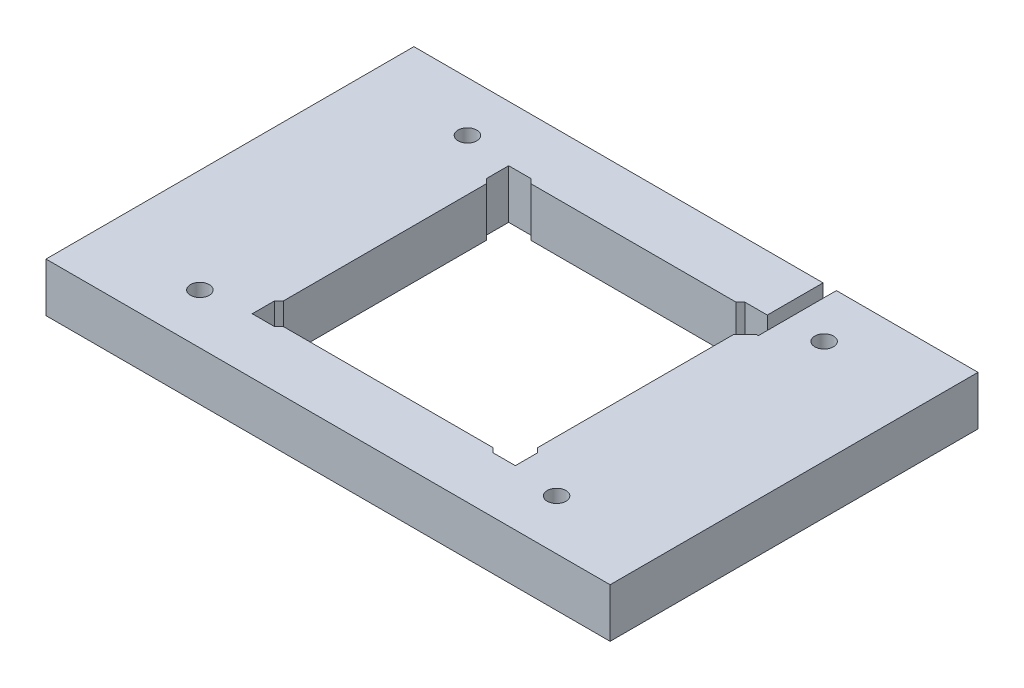
ISO-10303-21;
HEADER;
FILE_DESCRIPTION(('STEP AP214'),'2;1');
FILE_NAME('part.step','',(''),(''),'','','');
FILE_SCHEMA(('AUTOMOTIVE_DESIGN { 1 0 10303 214 1 1 1 1 }'));
ENDSEC;
DATA;
#1=APPLICATION_CONTEXT('core data for automotive mechanical design processes');
#2=APPLICATION_PROTOCOL_DEFINITION('international standard','automotive_design',2000,#1);
#3=PRODUCT_CONTEXT('',#1,'mechanical');
#4=PRODUCT('Part','Part','',(#3));
#5=PRODUCT_RELATED_PRODUCT_CATEGORY('part','',(#4));
#6=PRODUCT_DEFINITION_FORMATION('','',#4);
#7=PRODUCT_DEFINITION_CONTEXT('part definition',#1,'design');
#8=PRODUCT_DEFINITION('design','',#6,#7);
#9=PRODUCT_DEFINITION_SHAPE('','',#8);
#10=(LENGTH_UNIT() NAMED_UNIT(*) SI_UNIT(.MILLI.,.METRE.));
#11=(NAMED_UNIT(*) PLANE_ANGLE_UNIT() SI_UNIT($,.RADIAN.));
#12=(NAMED_UNIT(*) SI_UNIT($,.STERADIAN.) SOLID_ANGLE_UNIT());
#13=UNCERTAINTY_MEASURE_WITH_UNIT(LENGTH_MEASURE(1.E-05),#10,'distance_accuracy_value','');
#14=(GEOMETRIC_REPRESENTATION_CONTEXT(3) GLOBAL_UNCERTAINTY_ASSIGNED_CONTEXT((#13)) GLOBAL_UNIT_ASSIGNED_CONTEXT((#10,
#11,#12)) REPRESENTATION_CONTEXT('',''));
#15=CARTESIAN_POINT('',(0.,0.,0.));
#16=DIRECTION('',(0.,0.,1.));
#17=DIRECTION('',(1.,0.,0.));
#18=AXIS2_PLACEMENT_3D('',#15,#16,#17);
#19=CARTESIAN_POINT('',(0.,11.,0.));
#20=DIRECTION('',(0.,-1.,0.));
#21=DIRECTION('',(0.,0.,-1.));
#22=AXIS2_PLACEMENT_3D('',#19,#20,#21);
#23=PLANE('',#22);
#24=DIRECTION('',(1.,0.,0.));
#25=VECTOR('',#24,1.);
#26=CARTESIAN_POINT('',(-24.5,11.,-27.75));
#27=LINE('',#26,#25);
#28=CARTESIAN_POINT('',(-23.5,11.,-27.75));
#29=VERTEX_POINT('',#28);
#30=CARTESIAN_POINT('',(22.5,11.,-27.75));
#31=VERTEX_POINT('',#30);
#32=EDGE_CURVE('E434',#29,#31,#27,.T.);
#33=ORIENTED_EDGE('',*,*,#32,.T.);
#34=DIRECTION('',(-0.707106781186552,0.,0.707106781186543));
#35=VECTOR('',#34,1.);
#36=CARTESIAN_POINT('',(23.5,11.,-28.75));
#37=LINE('',#36,#35);
#38=CARTESIAN_POINT('',(23.5,11.,-28.75));
#39=VERTEX_POINT('',#38);
#40=EDGE_CURVE('E283',#31,#39,#37,.F.);
#41=ORIENTED_EDGE('',*,*,#40,.T.);
#42=DIRECTION('',(1.,0.,0.));
#43=VECTOR('',#42,1.);
#44=CARTESIAN_POINT('',(28.5,11.,-28.75));
#45=LINE('',#44,#43);
#46=CARTESIAN_POINT('',(28.5,11.,-28.75));
#47=VERTEX_POINT('',#46);
#48=EDGE_CURVE('E230',#39,#47,#45,.T.);
#49=ORIENTED_EDGE('',*,*,#48,.T.);
#50=DIRECTION('',(0.,0.,-1.));
#51=VECTOR('',#50,1.);
#52=CARTESIAN_POINT('',(28.5,11.,-28.75));
#53=LINE('',#52,#51);
#54=CARTESIAN_POINT('',(28.5,11.,-41.25));
#55=VERTEX_POINT('',#54);
#56=EDGE_CURVE('E224',#47,#55,#53,.T.);
#57=ORIENTED_EDGE('',*,*,#56,.T.);
#58=DIRECTION('',(-1.,0.,0.));
#59=VECTOR('',#58,1.);
#60=CARTESIAN_POINT('',(-63.25,11.,-41.25));
#61=LINE('',#60,#59);
#62=CARTESIAN_POINT('',(-63.25,11.,-41.25));
#63=VERTEX_POINT('',#62);
#64=EDGE_CURVE('E214',#55,#63,#61,.T.);
#65=ORIENTED_EDGE('',*,*,#64,.T.);
#66=DIRECTION('',(0.,0.,1.));
#67=VECTOR('',#66,1.);
#68=CARTESIAN_POINT('',(-63.25,11.,41.25));
#69=LINE('',#68,#67);
#70=CARTESIAN_POINT('',(-63.25,11.,41.25));
#71=VERTEX_POINT('',#70);
#72=EDGE_CURVE('E223',#63,#71,#69,.T.);
#73=ORIENTED_EDGE('',*,*,#72,.T.);
#74=DIRECTION('',(1.,0.,0.));
#75=VECTOR('',#74,1.);
#76=CARTESIAN_POINT('',(-63.25,11.,41.25));
#77=LINE('',#76,#75);
#78=CARTESIAN_POINT('',(63.25,11.,41.25));
#79=VERTEX_POINT('',#78);
#80=EDGE_CURVE('E383',#71,#79,#77,.T.);
#81=ORIENTED_EDGE('',*,*,#80,.T.);
#82=DIRECTION('',(0.,0.,-1.));
#83=VECTOR('',#82,1.);
#84=CARTESIAN_POINT('',(63.25,11.,-41.25));
#85=LINE('',#84,#83);
#86=CARTESIAN_POINT('',(63.25,11.,-41.25));
#87=VERTEX_POINT('',#86);
#88=EDGE_CURVE('E440',#79,#87,#85,.T.);
#89=ORIENTED_EDGE('',*,*,#88,.T.);
#90=DIRECTION('',(-1.,0.,0.));
#91=VECTOR('',#90,1.);
#92=CARTESIAN_POINT('',(31.5,11.,-41.25));
#93=LINE('',#92,#91);
#94=CARTESIAN_POINT('',(31.5,11.,-41.25));
#95=VERTEX_POINT('',#94);
#96=EDGE_CURVE('E444',#87,#95,#93,.T.);
#97=ORIENTED_EDGE('',*,*,#96,.T.);
#98=DIRECTION('',(0.,0.,1.));
#99=VECTOR('',#98,1.);
#100=CARTESIAN_POINT('',(31.4999999999999,11.,-27.75));
#101=LINE('',#100,#99);
#102=CARTESIAN_POINT('',(31.4999999999999,11.,-23.75));
#103=VERTEX_POINT('',#102);
#104=EDGE_CURVE('E446',#95,#103,#101,.T.);
#105=ORIENTED_EDGE('',*,*,#104,.T.);
#106=DIRECTION('',(-1.,0.,0.));
#107=VECTOR('',#106,1.);
#108=CARTESIAN_POINT('',(31.4999999999999,11.,-23.75));
#109=LINE('',#108,#107);
#110=CARTESIAN_POINT('',(31.,11.,-23.75));
#111=VERTEX_POINT('',#110);
#112=EDGE_CURVE('E448',#103,#111,#109,.T.);
#113=ORIENTED_EDGE('',*,*,#112,.T.);
#114=DIRECTION('',(0.707106781186551,0.,-0.707106781186544));
#115=VECTOR('',#114,1.);
#116=CARTESIAN_POINT('',(28.5,11.,-21.25));
#117=LINE('',#116,#115);
#118=CARTESIAN_POINT('',(28.5,11.,-21.25));
#119=VERTEX_POINT('',#118);
#120=EDGE_CURVE('E251',#111,#119,#117,.F.);
#121=ORIENTED_EDGE('',*,*,#120,.T.);
#122=DIRECTION('',(0.,0.,1.));
#123=VECTOR('',#122,1.);
#124=CARTESIAN_POINT('',(28.5,11.,23.75));
#125=LINE('',#124,#123);
#126=CARTESIAN_POINT('',(28.5,11.,22.75));
#127=VERTEX_POINT('',#126);
#128=EDGE_CURVE('E421',#119,#127,#125,.T.);
#129=ORIENTED_EDGE('',*,*,#128,.T.);
#130=DIRECTION('',(-0.707106781186543,0.,-0.707106781186552));
#131=VECTOR('',#130,1.);
#132=CARTESIAN_POINT('',(29.5,11.,23.75));
#133=LINE('',#132,#131);
#134=CARTESIAN_POINT('',(29.5,11.,23.75));
#135=VERTEX_POINT('',#134);
#136=EDGE_CURVE('E281',#127,#135,#133,.F.);
#137=ORIENTED_EDGE('',*,*,#136,.T.);
#138=DIRECTION('',(0.,0.,1.));
#139=VECTOR('',#138,1.);
#140=CARTESIAN_POINT('',(29.5,11.,28.75));
#141=LINE('',#140,#139);
#142=CARTESIAN_POINT('',(29.5,11.,28.75));
#143=VERTEX_POINT('',#142);
#144=EDGE_CURVE('E417',#135,#143,#141,.T.);
#145=ORIENTED_EDGE('',*,*,#144,.T.);
#146=DIRECTION('',(-1.,0.,0.));
#147=VECTOR('',#146,1.);
#148=CARTESIAN_POINT('',(29.5,11.,28.75));
#149=LINE('',#148,#147);
#150=CARTESIAN_POINT('',(24.5,11.,28.75));
#151=VERTEX_POINT('',#150);
#152=EDGE_CURVE('E416',#143,#151,#149,.T.);
#153=ORIENTED_EDGE('',*,*,#152,.T.);
#154=DIRECTION('',(0.707106781186543,0.,0.707106781186552));
#155=VECTOR('',#154,1.);
#156=CARTESIAN_POINT('',(23.5,11.,27.75));
#157=LINE('',#156,#155);
#158=CARTESIAN_POINT('',(23.5,11.,27.75));
#159=VERTEX_POINT('',#158);
#160=EDGE_CURVE('E279',#151,#159,#157,.F.);
#161=ORIENTED_EDGE('',*,*,#160,.T.);
#162=DIRECTION('',(-1.,0.,0.));
#163=VECTOR('',#162,1.);
#164=CARTESIAN_POINT('',(-24.5,11.,27.75));
#165=LINE('',#164,#163);
#166=CARTESIAN_POINT('',(-23.5,11.,27.75));
#167=VERTEX_POINT('',#166);
#168=EDGE_CURVE('E300',#159,#167,#165,.T.);
#169=ORIENTED_EDGE('',*,*,#168,.T.);
#170=DIRECTION('',(0.707106781186552,0.,-0.707106781186543));
#171=VECTOR('',#170,1.);
#172=CARTESIAN_POINT('',(-24.5,11.,28.75));
#173=LINE('',#172,#171);
#174=CARTESIAN_POINT('',(-24.5,11.,28.75));
#175=VERTEX_POINT('',#174);
#176=EDGE_CURVE('E277',#167,#175,#173,.F.);
#177=ORIENTED_EDGE('',*,*,#176,.T.);
#178=DIRECTION('',(-1.,0.,0.));
#179=VECTOR('',#178,1.);
#180=CARTESIAN_POINT('',(-29.5,11.,28.75));
#181=LINE('',#180,#179);
#182=CARTESIAN_POINT('',(-29.5,11.,28.75));
#183=VERTEX_POINT('',#182);
#184=EDGE_CURVE('E419',#175,#183,#181,.T.);
#185=ORIENTED_EDGE('',*,*,#184,.T.);
#186=DIRECTION('',(0.,0.,-1.));
#187=VECTOR('',#186,1.);
#188=CARTESIAN_POINT('',(-29.5,11.,23.75));
#189=LINE('',#188,#187);
#190=CARTESIAN_POINT('',(-29.5,11.,23.75));
#191=VERTEX_POINT('',#190);
#192=EDGE_CURVE('E426',#183,#191,#189,.T.);
#193=ORIENTED_EDGE('',*,*,#192,.T.);
#194=DIRECTION('',(-0.707106781186543,0.,0.707106781186552));
#195=VECTOR('',#194,1.);
#196=CARTESIAN_POINT('',(-28.5,11.,22.75));
#197=LINE('',#196,#195);
#198=CARTESIAN_POINT('',(-28.5,11.,22.75));
#199=VERTEX_POINT('',#198);
#200=EDGE_CURVE('E56',#191,#199,#197,.F.);
#201=ORIENTED_EDGE('',*,*,#200,.T.);
#202=DIRECTION('',(0.,0.,-1.));
#203=VECTOR('',#202,1.);
#204=CARTESIAN_POINT('',(-28.5,11.,-23.75));
#205=LINE('',#204,#203);
#206=CARTESIAN_POINT('',(-28.5,11.,-22.75));
#207=VERTEX_POINT('',#206);
#208=EDGE_CURVE('E428',#199,#207,#205,.T.);
#209=ORIENTED_EDGE('',*,*,#208,.T.);
#210=DIRECTION('',(0.707106781186543,0.,0.707106781186552));
#211=VECTOR('',#210,1.);
#212=CARTESIAN_POINT('',(-29.5,11.,-23.75));
#213=LINE('',#212,#211);
#214=CARTESIAN_POINT('',(-29.5,11.,-23.75));
#215=VERTEX_POINT('',#214);
#216=EDGE_CURVE('E274',#207,#215,#213,.F.);
#217=ORIENTED_EDGE('',*,*,#216,.T.);
#218=DIRECTION('',(0.,0.,-1.));
#219=VECTOR('',#218,1.);
#220=CARTESIAN_POINT('',(-29.5,11.,-28.75));
#221=LINE('',#220,#219);
#222=CARTESIAN_POINT('',(-29.5,11.,-28.75));
#223=VERTEX_POINT('',#222);
#224=EDGE_CURVE('E430',#215,#223,#221,.T.);
#225=ORIENTED_EDGE('',*,*,#224,.T.);
#226=DIRECTION('',(1.,0.,0.));
#227=VECTOR('',#226,1.);
#228=CARTESIAN_POINT('',(-29.5,11.,-28.75));
#229=LINE('',#228,#227);
#230=CARTESIAN_POINT('',(-24.5,11.,-28.75));
#231=VERTEX_POINT('',#230);
#232=EDGE_CURVE('E432',#223,#231,#229,.T.);
#233=ORIENTED_EDGE('',*,*,#232,.T.);
#234=DIRECTION('',(-0.707106781186552,0.,-0.707106781186543));
#235=VECTOR('',#234,1.);
#236=CARTESIAN_POINT('',(-23.5,11.,-27.75));
#237=LINE('',#236,#235);
#238=EDGE_CURVE('E272',#231,#29,#237,.F.);
#239=ORIENTED_EDGE('',*,*,#238,.T.);
#240=EDGE_LOOP('',(#33,#41,#49,#57,#65,#73,#81,#89,#97,#105,#113,#121,#129,#137,#145,#153,#161,
#169,#177,#185,#193,#201,#209,#217,#225,#233,#239));
#241=FACE_BOUND('',#240,.T.);
#242=CARTESIAN_POINT('',(-40.,11.,-30.));
#243=DIRECTION('',(0.,1.,0.));
#244=DIRECTION('',(0.,0.,1.));
#245=AXIS2_PLACEMENT_3D('',#242,#243,#244);
#246=CIRCLE('',#245,2.1);
#247=CARTESIAN_POINT('',(-40.,11.,-27.9));
#248=VERTEX_POINT('',#247);
#249=EDGE_CURVE('E437',#248,#248,#246,.T.);
#250=ORIENTED_EDGE('',*,*,#249,.F.);
#251=EDGE_LOOP('',(#250));
#252=FACE_BOUND('',#251,.T.);
#253=CARTESIAN_POINT('',(40.,11.,-30.));
#254=DIRECTION('',(0.,1.,0.));
#255=DIRECTION('',(0.,0.,1.));
#256=AXIS2_PLACEMENT_3D('',#253,#254,#255);
#257=CIRCLE('',#256,2.1);
#258=CARTESIAN_POINT('',(40.,11.,-27.9));
#259=VERTEX_POINT('',#258);
#260=EDGE_CURVE('E819',#259,#259,#257,.T.);
#261=ORIENTED_EDGE('',*,*,#260,.F.);
#262=EDGE_LOOP('',(#261));
#263=FACE_BOUND('',#262,.T.);
#264=CARTESIAN_POINT('',(40.,11.,30.));
#265=DIRECTION('',(0.,1.,0.));
#266=DIRECTION('',(0.,0.,1.));
#267=AXIS2_PLACEMENT_3D('',#264,#265,#266);
#268=CIRCLE('',#267,2.1);
#269=CARTESIAN_POINT('',(40.,11.,32.1));
#270=VERTEX_POINT('',#269);
#271=EDGE_CURVE('E813',#270,#270,#268,.T.);
#272=ORIENTED_EDGE('',*,*,#271,.F.);
#273=EDGE_LOOP('',(#272));
#274=FACE_BOUND('',#273,.T.);
#275=CARTESIAN_POINT('',(-40.,11.,30.));
#276=DIRECTION('',(0.,1.,0.));
#277=DIRECTION('',(0.,0.,1.));
#278=AXIS2_PLACEMENT_3D('',#275,#276,#277);
#279=CIRCLE('',#278,2.1);
#280=CARTESIAN_POINT('',(-40.,11.,32.1));
#281=VERTEX_POINT('',#280);
#282=EDGE_CURVE('E804',#281,#281,#279,.T.);
#283=ORIENTED_EDGE('',*,*,#282,.F.);
#284=EDGE_LOOP('',(#283));
#285=FACE_BOUND('',#284,.T.);
#286=ADVANCED_FACE('F35',(#241,#252,#263,#274,#285),#23,.F.);
#287=CARTESIAN_POINT('',(0.,0.,0.));
#288=DIRECTION('',(0.,-1.,0.));
#289=DIRECTION('',(0.,0.,-1.));
#290=AXIS2_PLACEMENT_3D('',#287,#288,#289);
#291=PLANE('',#290);
#292=CARTESIAN_POINT('',(40.,0.,30.));
#293=DIRECTION('',(0.,1.,0.));
#294=DIRECTION('',(0.,0.,1.));
#295=AXIS2_PLACEMENT_3D('',#292,#293,#294);
#296=CIRCLE('',#295,2.1);
#297=CARTESIAN_POINT('',(40.,0.,32.1));
#298=VERTEX_POINT('',#297);
#299=EDGE_CURVE('E810',#298,#298,#296,.T.);
#300=ORIENTED_EDGE('',*,*,#299,.T.);
#301=EDGE_LOOP('',(#300));
#302=FACE_BOUND('',#301,.T.);
#303=CARTESIAN_POINT('',(-40.,0.,-30.));
#304=DIRECTION('',(0.,1.,0.));
#305=DIRECTION('',(0.,0.,1.));
#306=AXIS2_PLACEMENT_3D('',#303,#304,#305);
#307=CIRCLE('',#306,2.1);
#308=CARTESIAN_POINT('',(-40.,0.,-27.9));
#309=VERTEX_POINT('',#308);
#310=EDGE_CURVE('E822',#309,#309,#307,.T.);
#311=ORIENTED_EDGE('',*,*,#310,.T.);
#312=EDGE_LOOP('',(#311));
#313=FACE_BOUND('',#312,.T.);
#314=DIRECTION('',(1.,0.,0.));
#315=VECTOR('',#314,1.);
#316=CARTESIAN_POINT('',(28.5,0.,-28.75));
#317=LINE('',#316,#315);
#318=CARTESIAN_POINT('',(23.5,0.,-28.75));
#319=VERTEX_POINT('',#318);
#320=CARTESIAN_POINT('',(28.5,0.,-28.75));
#321=VERTEX_POINT('',#320);
#322=EDGE_CURVE('E234',#319,#321,#317,.T.);
#323=ORIENTED_EDGE('',*,*,#322,.F.);
#324=DIRECTION('',(0.707106781186552,0.,-0.707106781186543));
#325=VECTOR('',#324,1.);
#326=CARTESIAN_POINT('',(-2.62500000000016,0.,-2.62500000000019));
#327=LINE('',#326,#325);
#328=CARTESIAN_POINT('',(22.5,0.,-27.75));
#329=VERTEX_POINT('',#328);
#330=EDGE_CURVE('E265',#319,#329,#327,.F.);
#331=ORIENTED_EDGE('',*,*,#330,.T.);
#332=DIRECTION('',(1.,0.,0.));
#333=VECTOR('',#332,1.);
#334=CARTESIAN_POINT('',(-24.5,0.,-27.75));
#335=LINE('',#334,#333);
#336=CARTESIAN_POINT('',(-23.5,0.,-27.75));
#337=VERTEX_POINT('',#336);
#338=EDGE_CURVE('E328',#337,#329,#335,.T.);
#339=ORIENTED_EDGE('',*,*,#338,.F.);
#340=DIRECTION('',(0.707106781186552,0.,0.707106781186543));
#341=VECTOR('',#340,1.);
#342=CARTESIAN_POINT('',(2.12500000000016,0.,-2.12500000000019));
#343=LINE('',#342,#341);
#344=CARTESIAN_POINT('',(-24.5,0.,-28.75));
#345=VERTEX_POINT('',#344);
#346=EDGE_CURVE('E253',#337,#345,#343,.F.);
#347=ORIENTED_EDGE('',*,*,#346,.T.);
#348=DIRECTION('',(1.,0.,0.));
#349=VECTOR('',#348,1.);
#350=CARTESIAN_POINT('',(-29.5,0.,-28.75));
#351=LINE('',#350,#349);
#352=CARTESIAN_POINT('',(-29.5,0.,-28.75));
#353=VERTEX_POINT('',#352);
#354=EDGE_CURVE('E325',#353,#345,#351,.T.);
#355=ORIENTED_EDGE('',*,*,#354,.F.);
#356=DIRECTION('',(0.,0.,-1.));
#357=VECTOR('',#356,1.);
#358=CARTESIAN_POINT('',(-29.5,0.,-28.75));
#359=LINE('',#358,#357);
#360=CARTESIAN_POINT('',(-29.5,0.,-23.75));
#361=VERTEX_POINT('',#360);
#362=EDGE_CURVE('E323',#361,#353,#359,.T.);
#363=ORIENTED_EDGE('',*,*,#362,.F.);
#364=DIRECTION('',(-0.707106781186543,0.,-0.707106781186552));
#365=VECTOR('',#364,1.);
#366=CARTESIAN_POINT('',(-2.8750000000002,0.,2.87500000000016));
#367=LINE('',#366,#365);
#368=CARTESIAN_POINT('',(-28.5,0.,-22.75));
#369=VERTEX_POINT('',#368);
#370=EDGE_CURVE('E255',#361,#369,#367,.F.);
#371=ORIENTED_EDGE('',*,*,#370,.T.);
#372=DIRECTION('',(0.,0.,-1.));
#373=VECTOR('',#372,1.);
#374=CARTESIAN_POINT('',(-28.5,0.,-23.75));
#375=LINE('',#374,#373);
#376=CARTESIAN_POINT('',(-28.5,0.,22.75));
#377=VERTEX_POINT('',#376);
#378=EDGE_CURVE('E321',#377,#369,#375,.T.);
#379=ORIENTED_EDGE('',*,*,#378,.F.);
#380=DIRECTION('',(0.707106781186543,0.,-0.707106781186552));
#381=VECTOR('',#380,1.);
#382=CARTESIAN_POINT('',(-2.87500000000019,0.,-2.87500000000015));
#383=LINE('',#382,#381);
#384=CARTESIAN_POINT('',(-29.5,0.,23.75));
#385=VERTEX_POINT('',#384);
#386=EDGE_CURVE('E257',#377,#385,#383,.F.);
#387=ORIENTED_EDGE('',*,*,#386,.T.);
#388=DIRECTION('',(0.,0.,-1.));
#389=VECTOR('',#388,1.);
#390=CARTESIAN_POINT('',(-29.5,0.,23.75));
#391=LINE('',#390,#389);
#392=CARTESIAN_POINT('',(-29.5,0.,28.75));
#393=VERTEX_POINT('',#392);
#394=EDGE_CURVE('E313',#393,#385,#391,.T.);
#395=ORIENTED_EDGE('',*,*,#394,.F.);
#396=DIRECTION('',(-1.,0.,0.));
#397=VECTOR('',#396,1.);
#398=CARTESIAN_POINT('',(-29.5,0.,28.75));
#399=LINE('',#398,#397);
#400=CARTESIAN_POINT('',(-24.5,0.,28.75));
#401=VERTEX_POINT('',#400);
#402=EDGE_CURVE('E310',#401,#393,#399,.T.);
#403=ORIENTED_EDGE('',*,*,#402,.F.);
#404=DIRECTION('',(-0.707106781186552,0.,0.707106781186543));
#405=VECTOR('',#404,1.);
#406=CARTESIAN_POINT('',(2.12500000000016,0.,2.12500000000019));
#407=LINE('',#406,#405);
#408=CARTESIAN_POINT('',(-23.5,0.,27.75));
#409=VERTEX_POINT('',#408);
#410=EDGE_CURVE('E259',#401,#409,#407,.F.);
#411=ORIENTED_EDGE('',*,*,#410,.T.);
#412=DIRECTION('',(-1.,0.,0.));
#413=VECTOR('',#412,1.);
#414=CARTESIAN_POINT('',(-24.5,0.,27.75));
#415=LINE('',#414,#413);
#416=CARTESIAN_POINT('',(23.5,0.,27.75));
#417=VERTEX_POINT('',#416);
#418=EDGE_CURVE('E297',#417,#409,#415,.T.);
#419=ORIENTED_EDGE('',*,*,#418,.F.);
#420=DIRECTION('',(-0.707106781186543,0.,-0.707106781186552));
#421=VECTOR('',#420,1.);
#422=CARTESIAN_POINT('',(-2.12499999999983,0.,2.1249999999998));
#423=LINE('',#422,#421);
#424=CARTESIAN_POINT('',(24.5,0.,28.75));
#425=VERTEX_POINT('',#424);
#426=EDGE_CURVE('E261',#417,#425,#423,.F.);
#427=ORIENTED_EDGE('',*,*,#426,.T.);
#428=DIRECTION('',(-1.,0.,0.));
#429=VECTOR('',#428,1.);
#430=CARTESIAN_POINT('',(29.5,0.,28.75));
#431=LINE('',#430,#429);
#432=CARTESIAN_POINT('',(29.5,0.,28.75));
#433=VERTEX_POINT('',#432);
#434=EDGE_CURVE('E311',#433,#425,#431,.T.);
#435=ORIENTED_EDGE('',*,*,#434,.F.);
#436=DIRECTION('',(0.,0.,1.));
#437=VECTOR('',#436,1.);
#438=CARTESIAN_POINT('',(29.5,0.,28.75));
#439=LINE('',#438,#437);
#440=CARTESIAN_POINT('',(29.5,0.,23.75));
#441=VERTEX_POINT('',#440);
#442=EDGE_CURVE('E315',#441,#433,#439,.T.);
#443=ORIENTED_EDGE('',*,*,#442,.F.);
#444=DIRECTION('',(0.707106781186543,0.,0.707106781186552));
#445=VECTOR('',#444,1.);
#446=CARTESIAN_POINT('',(2.8750000000002,0.,-2.87500000000016));
#447=LINE('',#446,#445);
#448=CARTESIAN_POINT('',(28.5,0.,22.75));
#449=VERTEX_POINT('',#448);
#450=EDGE_CURVE('E263',#441,#449,#447,.F.);
#451=ORIENTED_EDGE('',*,*,#450,.T.);
#452=DIRECTION('',(0.,0.,1.));
#453=VECTOR('',#452,1.);
#454=CARTESIAN_POINT('',(28.5,0.,23.75));
#455=LINE('',#454,#453);
#456=CARTESIAN_POINT('',(28.5,0.,-21.25));
#457=VERTEX_POINT('',#456);
#458=EDGE_CURVE('E404',#457,#449,#455,.T.);
#459=ORIENTED_EDGE('',*,*,#458,.F.);
#460=DIRECTION('',(-0.707106781186551,0.,0.707106781186544));
#461=VECTOR('',#460,1.);
#462=CARTESIAN_POINT('',(3.62499999999983,0.,3.62499999999987));
#463=LINE('',#462,#461);
#464=CARTESIAN_POINT('',(31.,0.,-23.75));
#465=VERTEX_POINT('',#464);
#466=EDGE_CURVE('E242',#457,#465,#463,.F.);
#467=ORIENTED_EDGE('',*,*,#466,.T.);
#468=DIRECTION('',(-1.,0.,0.));
#469=VECTOR('',#468,1.);
#470=CARTESIAN_POINT('',(31.4999999999999,0.,-23.75));
#471=LINE('',#470,#469);
#472=CARTESIAN_POINT('',(31.4999999999999,0.,-23.75));
#473=VERTEX_POINT('',#472);
#474=EDGE_CURVE('E401',#473,#465,#471,.T.);
#475=ORIENTED_EDGE('',*,*,#474,.F.);
#476=DIRECTION('',(0.,0.,1.));
#477=VECTOR('',#476,1.);
#478=CARTESIAN_POINT('',(31.4999999999999,0.,-27.75));
#479=LINE('',#478,#477);
#480=CARTESIAN_POINT('',(31.5,0.,-41.25));
#481=VERTEX_POINT('',#480);
#482=EDGE_CURVE('E399',#481,#473,#479,.T.);
#483=ORIENTED_EDGE('',*,*,#482,.F.);
#484=DIRECTION('',(-1.,0.,0.));
#485=VECTOR('',#484,1.);
#486=CARTESIAN_POINT('',(31.5,0.,-41.25));
#487=LINE('',#486,#485);
#488=CARTESIAN_POINT('',(63.25,0.,-41.25));
#489=VERTEX_POINT('',#488);
#490=EDGE_CURVE('E391',#489,#481,#487,.T.);
#491=ORIENTED_EDGE('',*,*,#490,.F.);
#492=DIRECTION('',(0.,0.,-1.));
#493=VECTOR('',#492,1.);
#494=CARTESIAN_POINT('',(63.25,0.,-41.25));
#495=LINE('',#494,#493);
#496=CARTESIAN_POINT('',(63.25,0.,41.25));
#497=VERTEX_POINT('',#496);
#498=EDGE_CURVE('E389',#497,#489,#495,.T.);
#499=ORIENTED_EDGE('',*,*,#498,.F.);
#500=DIRECTION('',(1.,0.,0.));
#501=VECTOR('',#500,1.);
#502=CARTESIAN_POINT('',(-63.25,0.,41.25));
#503=LINE('',#502,#501);
#504=CARTESIAN_POINT('',(-63.25,0.,41.25));
#505=VERTEX_POINT('',#504);
#506=EDGE_CURVE('E382',#505,#497,#503,.T.);
#507=ORIENTED_EDGE('',*,*,#506,.F.);
#508=DIRECTION('',(0.,0.,1.));
#509=VECTOR('',#508,1.);
#510=CARTESIAN_POINT('',(-63.25,0.,41.25));
#511=LINE('',#510,#509);
#512=CARTESIAN_POINT('',(-63.25,0.,-41.25));
#513=VERTEX_POINT('',#512);
#514=EDGE_CURVE('E387',#513,#505,#511,.T.);
#515=ORIENTED_EDGE('',*,*,#514,.F.);
#516=DIRECTION('',(-1.,0.,0.));
#517=VECTOR('',#516,1.);
#518=CARTESIAN_POINT('',(-63.25,0.,-41.25));
#519=LINE('',#518,#517);
#520=CARTESIAN_POINT('',(28.5,0.,-41.25));
#521=VERTEX_POINT('',#520);
#522=EDGE_CURVE('E393',#521,#513,#519,.T.);
#523=ORIENTED_EDGE('',*,*,#522,.F.);
#524=DIRECTION('',(0.,0.,-1.));
#525=VECTOR('',#524,1.);
#526=CARTESIAN_POINT('',(28.5,0.,-28.75));
#527=LINE('',#526,#525);
#528=EDGE_CURVE('E238',#321,#521,#527,.T.);
#529=ORIENTED_EDGE('',*,*,#528,.F.);
#530=EDGE_LOOP('',(#323,#331,#339,#347,#355,#363,#371,#379,#387,#395,#403,#411,#419,#427,#435,
#443,#451,#459,#467,#475,#483,#491,#499,#507,#515,#523,#529));
#531=FACE_BOUND('',#530,.T.);
#532=CARTESIAN_POINT('',(40.,0.,-30.));
#533=DIRECTION('',(0.,1.,0.));
#534=DIRECTION('',(0.,0.,1.));
#535=AXIS2_PLACEMENT_3D('',#532,#533,#534);
#536=CIRCLE('',#535,2.1);
#537=CARTESIAN_POINT('',(40.,0.,-27.9));
#538=VERTEX_POINT('',#537);
#539=EDGE_CURVE('E816',#538,#538,#536,.T.);
#540=ORIENTED_EDGE('',*,*,#539,.T.);
#541=EDGE_LOOP('',(#540));
#542=FACE_BOUND('',#541,.T.);
#543=CARTESIAN_POINT('',(-40.,0.,30.));
#544=DIRECTION('',(0.,1.,0.));
#545=DIRECTION('',(0.,0.,1.));
#546=AXIS2_PLACEMENT_3D('',#543,#544,#545);
#547=CIRCLE('',#546,2.1);
#548=CARTESIAN_POINT('',(-40.,0.,32.1));
#549=VERTEX_POINT('',#548);
#550=EDGE_CURVE('E807',#549,#549,#547,.T.);
#551=ORIENTED_EDGE('',*,*,#550,.T.);
#552=EDGE_LOOP('',(#551));
#553=FACE_BOUND('',#552,.T.);
#554=ADVANCED_FACE('F305',(#302,#313,#531,#542,#553),#291,.T.);
#555=CARTESIAN_POINT('',(28.5,11.,-28.75));
#556=DIRECTION('',(-1.,0.,0.));
#557=DIRECTION('',(0.,0.,1.));
#558=AXIS2_PLACEMENT_3D('',#555,#556,#557);
#559=PLANE('',#558);
#560=ORIENTED_EDGE('',*,*,#528,.T.);
#561=DIRECTION('',(0.,-1.,0.));
#562=VECTOR('',#561,1.);
#563=CARTESIAN_POINT('',(28.5,11.,-41.25));
#564=LINE('',#563,#562);
#565=EDGE_CURVE('E218',#55,#521,#564,.T.);
#566=ORIENTED_EDGE('',*,*,#565,.F.);
#567=ORIENTED_EDGE('',*,*,#56,.F.);
#568=DIRECTION('',(0.,-1.,0.));
#569=VECTOR('',#568,1.);
#570=CARTESIAN_POINT('',(28.5,11.,-28.75));
#571=LINE('',#570,#569);
#572=EDGE_CURVE('E332',#47,#321,#571,.T.);
#573=ORIENTED_EDGE('',*,*,#572,.T.);
#574=EDGE_LOOP('',(#560,#566,#567,#573));
#575=FACE_BOUND('',#574,.T.);
#576=ADVANCED_FACE('F236',(#575),#559,.F.);
#577=CARTESIAN_POINT('',(-63.25,11.,-41.25));
#578=DIRECTION('',(0.,0.,1.));
#579=DIRECTION('',(1.,0.,0.));
#580=AXIS2_PLACEMENT_3D('',#577,#578,#579);
#581=PLANE('',#580);
#582=ORIENTED_EDGE('',*,*,#522,.T.);
#583=DIRECTION('',(0.,-1.,0.));
#584=VECTOR('',#583,1.);
#585=CARTESIAN_POINT('',(-63.25,11.,-41.25));
#586=LINE('',#585,#584);
#587=EDGE_CURVE('E221',#63,#513,#586,.T.);
#588=ORIENTED_EDGE('',*,*,#587,.F.);
#589=ORIENTED_EDGE('',*,*,#64,.F.);
#590=ORIENTED_EDGE('',*,*,#565,.T.);
#591=EDGE_LOOP('',(#582,#588,#589,#590));
#592=FACE_BOUND('',#591,.T.);
#593=ADVANCED_FACE('F216',(#592),#581,.F.);
#594=CARTESIAN_POINT('',(-63.25,11.,41.25));
#595=DIRECTION('',(1.,0.,0.));
#596=DIRECTION('',(0.,0.,-1.));
#597=AXIS2_PLACEMENT_3D('',#594,#595,#596);
#598=PLANE('',#597);
#599=ORIENTED_EDGE('',*,*,#514,.T.);
#600=DIRECTION('',(0.,-1.,0.));
#601=VECTOR('',#600,1.);
#602=CARTESIAN_POINT('',(-63.25,11.,41.25));
#603=LINE('',#602,#601);
#604=EDGE_CURVE('E244',#71,#505,#603,.T.);
#605=ORIENTED_EDGE('',*,*,#604,.F.);
#606=ORIENTED_EDGE('',*,*,#72,.F.);
#607=ORIENTED_EDGE('',*,*,#587,.T.);
#608=EDGE_LOOP('',(#599,#605,#606,#607));
#609=FACE_BOUND('',#608,.T.);
#610=ADVANCED_FACE('F438',(#609),#598,.F.);
#611=CARTESIAN_POINT('',(-63.25,11.,41.25));
#612=DIRECTION('',(0.,0.,-1.));
#613=DIRECTION('',(-1.,0.,0.));
#614=AXIS2_PLACEMENT_3D('',#611,#612,#613);
#615=PLANE('',#614);
#616=ORIENTED_EDGE('',*,*,#506,.T.);
#617=DIRECTION('',(0.,-1.,0.));
#618=VECTOR('',#617,1.);
#619=CARTESIAN_POINT('',(63.25,11.,41.25));
#620=LINE('',#619,#618);
#621=EDGE_CURVE('E373',#79,#497,#620,.T.);
#622=ORIENTED_EDGE('',*,*,#621,.F.);
#623=ORIENTED_EDGE('',*,*,#80,.F.);
#624=ORIENTED_EDGE('',*,*,#604,.T.);
#625=EDGE_LOOP('',(#616,#622,#623,#624));
#626=FACE_BOUND('',#625,.T.);
#627=ADVANCED_FACE('F380',(#626),#615,.F.);
#628=CARTESIAN_POINT('',(63.25,11.,-41.25));
#629=DIRECTION('',(-1.,0.,0.));
#630=DIRECTION('',(0.,0.,1.));
#631=AXIS2_PLACEMENT_3D('',#628,#629,#630);
#632=PLANE('',#631);
#633=ORIENTED_EDGE('',*,*,#498,.T.);
#634=DIRECTION('',(0.,-1.,0.));
#635=VECTOR('',#634,1.);
#636=CARTESIAN_POINT('',(63.25,11.,-41.25));
#637=LINE('',#636,#635);
#638=EDGE_CURVE('E370',#87,#489,#637,.T.);
#639=ORIENTED_EDGE('',*,*,#638,.F.);
#640=ORIENTED_EDGE('',*,*,#88,.F.);
#641=ORIENTED_EDGE('',*,*,#621,.T.);
#642=EDGE_LOOP('',(#633,#639,#640,#641));
#643=FACE_BOUND('',#642,.T.);
#644=ADVANCED_FACE('F479',(#643),#632,.F.);
#645=CARTESIAN_POINT('',(31.5,11.,-41.25));
#646=DIRECTION('',(0.,0.,1.));
#647=DIRECTION('',(1.,0.,0.));
#648=AXIS2_PLACEMENT_3D('',#645,#646,#647);
#649=PLANE('',#648);
#650=ORIENTED_EDGE('',*,*,#490,.T.);
#651=DIRECTION('',(0.,-1.,0.));
#652=VECTOR('',#651,1.);
#653=CARTESIAN_POINT('',(31.5,11.,-41.25));
#654=LINE('',#653,#652);
#655=EDGE_CURVE('E367',#95,#481,#654,.T.);
#656=ORIENTED_EDGE('',*,*,#655,.F.);
#657=ORIENTED_EDGE('',*,*,#96,.F.);
#658=ORIENTED_EDGE('',*,*,#638,.T.);
#659=EDGE_LOOP('',(#650,#656,#657,#658));
#660=FACE_BOUND('',#659,.T.);
#661=ADVANCED_FACE('F474',(#660),#649,.F.);
#662=CARTESIAN_POINT('',(31.4999999999999,11.,-27.75));
#663=DIRECTION('',(1.,0.,0.));
#664=DIRECTION('',(0.,0.,-1.));
#665=AXIS2_PLACEMENT_3D('',#662,#663,#664);
#666=PLANE('',#665);
#667=ORIENTED_EDGE('',*,*,#482,.T.);
#668=DIRECTION('',(0.,-1.,0.));
#669=VECTOR('',#668,1.);
#670=CARTESIAN_POINT('',(31.4999999999999,11.,-23.75));
#671=LINE('',#670,#669);
#672=EDGE_CURVE('E364',#103,#473,#671,.T.);
#673=ORIENTED_EDGE('',*,*,#672,.F.);
#674=ORIENTED_EDGE('',*,*,#104,.F.);
#675=ORIENTED_EDGE('',*,*,#655,.T.);
#676=EDGE_LOOP('',(#667,#673,#674,#675));
#677=FACE_BOUND('',#676,.T.);
#678=ADVANCED_FACE('F471',(#677),#666,.F.);
#679=CARTESIAN_POINT('',(31.4999999999999,11.,-23.75));
#680=DIRECTION('',(0.,0.,1.));
#681=DIRECTION('',(1.,0.,0.));
#682=AXIS2_PLACEMENT_3D('',#679,#680,#681);
#683=PLANE('',#682);
#684=ORIENTED_EDGE('',*,*,#474,.T.);
#685=DIRECTION('',(0.,1.,0.));
#686=VECTOR('',#685,1.);
#687=CARTESIAN_POINT('',(31.,11.,-23.75));
#688=LINE('',#687,#686);
#689=EDGE_CURVE('E249',#465,#111,#688,.T.);
#690=ORIENTED_EDGE('',*,*,#689,.T.);
#691=ORIENTED_EDGE('',*,*,#112,.F.);
#692=ORIENTED_EDGE('',*,*,#672,.T.);
#693=EDGE_LOOP('',(#684,#690,#691,#692));
#694=FACE_BOUND('',#693,.T.);
#695=ADVANCED_FACE('F466',(#694),#683,.F.);
#696=CARTESIAN_POINT('',(28.5,11.,23.75));
#697=DIRECTION('',(1.,0.,0.));
#698=DIRECTION('',(0.,0.,-1.));
#699=AXIS2_PLACEMENT_3D('',#696,#697,#698);
#700=PLANE('',#699);
#701=ORIENTED_EDGE('',*,*,#458,.T.);
#702=DIRECTION('',(0.,1.,0.));
#703=VECTOR('',#702,1.);
#704=CARTESIAN_POINT('',(28.5,11.,22.75));
#705=LINE('',#704,#703);
#706=EDGE_CURVE('E285',#449,#127,#705,.T.);
#707=ORIENTED_EDGE('',*,*,#706,.T.);
#708=ORIENTED_EDGE('',*,*,#128,.F.);
#709=DIRECTION('',(0.,-1.,0.));
#710=VECTOR('',#709,1.);
#711=CARTESIAN_POINT('',(28.5,11.,-21.25));
#712=LINE('',#711,#710);
#713=EDGE_CURVE('E239',#119,#457,#712,.T.);
#714=ORIENTED_EDGE('',*,*,#713,.T.);
#715=EDGE_LOOP('',(#701,#707,#708,#714));
#716=FACE_BOUND('',#715,.T.);
#717=ADVANCED_FACE('F460',(#716),#700,.F.);
#718=CARTESIAN_POINT('',(29.5,11.,28.75));
#719=DIRECTION('',(1.,0.,0.));
#720=DIRECTION('',(0.,0.,-1.));
#721=AXIS2_PLACEMENT_3D('',#718,#719,#720);
#722=PLANE('',#721);
#723=ORIENTED_EDGE('',*,*,#442,.T.);
#724=DIRECTION('',(0.,-1.,0.));
#725=VECTOR('',#724,1.);
#726=CARTESIAN_POINT('',(29.5,11.,28.75));
#727=LINE('',#726,#725);
#728=EDGE_CURVE('E358',#143,#433,#727,.T.);
#729=ORIENTED_EDGE('',*,*,#728,.F.);
#730=ORIENTED_EDGE('',*,*,#144,.F.);
#731=DIRECTION('',(0.,-1.,0.));
#732=VECTOR('',#731,1.);
#733=CARTESIAN_POINT('',(29.5,11.,23.75));
#734=LINE('',#733,#732);
#735=EDGE_CURVE('E361',#135,#441,#734,.T.);
#736=ORIENTED_EDGE('',*,*,#735,.T.);
#737=EDGE_LOOP('',(#723,#729,#730,#736));
#738=FACE_BOUND('',#737,.T.);
#739=ADVANCED_FACE('F409',(#738),#722,.F.);
#740=CARTESIAN_POINT('',(29.5,11.,28.75));
#741=DIRECTION('',(0.,0.,1.));
#742=DIRECTION('',(1.,0.,0.));
#743=AXIS2_PLACEMENT_3D('',#740,#741,#742);
#744=PLANE('',#743);
#745=ORIENTED_EDGE('',*,*,#434,.T.);
#746=DIRECTION('',(0.,-1.,0.));
#747=VECTOR('',#746,1.);
#748=CARTESIAN_POINT('',(24.5,11.,28.75));
#749=LINE('',#748,#747);
#750=EDGE_CURVE('E355',#151,#425,#749,.T.);
#751=ORIENTED_EDGE('',*,*,#750,.F.);
#752=ORIENTED_EDGE('',*,*,#152,.F.);
#753=ORIENTED_EDGE('',*,*,#728,.T.);
#754=EDGE_LOOP('',(#745,#751,#752,#753));
#755=FACE_BOUND('',#754,.T.);
#756=ADVANCED_FACE('F414',(#755),#744,.F.);
#757=CARTESIAN_POINT('',(-24.5,11.,27.75));
#758=DIRECTION('',(0.,0.,1.));
#759=DIRECTION('',(1.,0.,0.));
#760=AXIS2_PLACEMENT_3D('',#757,#758,#759);
#761=PLANE('',#760);
#762=ORIENTED_EDGE('',*,*,#168,.F.);
#763=DIRECTION('',(0.,-1.,0.));
#764=VECTOR('',#763,1.);
#765=CARTESIAN_POINT('',(23.5,11.,27.75));
#766=LINE('',#765,#764);
#767=EDGE_CURVE('E289',#159,#417,#766,.T.);
#768=ORIENTED_EDGE('',*,*,#767,.T.);
#769=ORIENTED_EDGE('',*,*,#418,.T.);
#770=DIRECTION('',(0.,1.,0.));
#771=VECTOR('',#770,1.);
#772=CARTESIAN_POINT('',(-23.5,11.,27.75));
#773=LINE('',#772,#771);
#774=EDGE_CURVE('E287',#409,#167,#773,.T.);
#775=ORIENTED_EDGE('',*,*,#774,.T.);
#776=EDGE_LOOP('',(#762,#768,#769,#775));
#777=FACE_BOUND('',#776,.T.);
#778=ADVANCED_FACE('F296',(#777),#761,.F.);
#779=CARTESIAN_POINT('',(-29.5,11.,28.75));
#780=DIRECTION('',(0.,0.,1.));
#781=DIRECTION('',(1.,0.,0.));
#782=AXIS2_PLACEMENT_3D('',#779,#780,#781);
#783=PLANE('',#782);
#784=ORIENTED_EDGE('',*,*,#402,.T.);
#785=DIRECTION('',(0.,-1.,0.));
#786=VECTOR('',#785,1.);
#787=CARTESIAN_POINT('',(-29.5,11.,28.75));
#788=LINE('',#787,#786);
#789=EDGE_CURVE('E349',#183,#393,#788,.T.);
#790=ORIENTED_EDGE('',*,*,#789,.F.);
#791=ORIENTED_EDGE('',*,*,#184,.F.);
#792=DIRECTION('',(0.,-1.,0.));
#793=VECTOR('',#792,1.);
#794=CARTESIAN_POINT('',(-24.5,11.,28.75));
#795=LINE('',#794,#793);
#796=EDGE_CURVE('E352',#175,#401,#795,.T.);
#797=ORIENTED_EDGE('',*,*,#796,.T.);
#798=EDGE_LOOP('',(#784,#790,#791,#797));
#799=FACE_BOUND('',#798,.T.);
#800=ADVANCED_FACE('F522',(#799),#783,.F.);
#801=CARTESIAN_POINT('',(-29.5,11.,23.75));
#802=DIRECTION('',(-1.,0.,0.));
#803=DIRECTION('',(0.,0.,1.));
#804=AXIS2_PLACEMENT_3D('',#801,#802,#803);
#805=PLANE('',#804);
#806=ORIENTED_EDGE('',*,*,#394,.T.);
#807=DIRECTION('',(0.,-1.,0.));
#808=VECTOR('',#807,1.);
#809=CARTESIAN_POINT('',(-29.5,11.,23.75));
#810=LINE('',#809,#808);
#811=EDGE_CURVE('E346',#191,#385,#810,.T.);
#812=ORIENTED_EDGE('',*,*,#811,.F.);
#813=ORIENTED_EDGE('',*,*,#192,.F.);
#814=ORIENTED_EDGE('',*,*,#789,.T.);
#815=EDGE_LOOP('',(#806,#812,#813,#814));
#816=FACE_BOUND('',#815,.T.);
#817=ADVANCED_FACE('F519',(#816),#805,.F.);
#818=CARTESIAN_POINT('',(-28.5,11.,-23.75));
#819=DIRECTION('',(-1.,0.,0.));
#820=DIRECTION('',(0.,0.,1.));
#821=AXIS2_PLACEMENT_3D('',#818,#819,#820);
#822=PLANE('',#821);
#823=ORIENTED_EDGE('',*,*,#208,.F.);
#824=DIRECTION('',(0.,-1.,0.));
#825=VECTOR('',#824,1.);
#826=CARTESIAN_POINT('',(-28.5,11.,22.75));
#827=LINE('',#826,#825);
#828=EDGE_CURVE('E11',#199,#377,#827,.T.);
#829=ORIENTED_EDGE('',*,*,#828,.T.);
#830=ORIENTED_EDGE('',*,*,#378,.T.);
#831=DIRECTION('',(0.,1.,0.));
#832=VECTOR('',#831,1.);
#833=CARTESIAN_POINT('',(-28.5,11.,-22.75));
#834=LINE('',#833,#832);
#835=EDGE_CURVE('E43',#369,#207,#834,.T.);
#836=ORIENTED_EDGE('',*,*,#835,.T.);
#837=EDGE_LOOP('',(#823,#829,#830,#836));
#838=FACE_BOUND('',#837,.T.);
#839=ADVANCED_FACE('F515',(#838),#822,.F.);
#840=CARTESIAN_POINT('',(-29.5,11.,-28.75));
#841=DIRECTION('',(-1.,0.,0.));
#842=DIRECTION('',(0.,0.,1.));
#843=AXIS2_PLACEMENT_3D('',#840,#841,#842);
#844=PLANE('',#843);
#845=ORIENTED_EDGE('',*,*,#362,.T.);
#846=DIRECTION('',(0.,-1.,0.));
#847=VECTOR('',#846,1.);
#848=CARTESIAN_POINT('',(-29.5,11.,-28.75));
#849=LINE('',#848,#847);
#850=EDGE_CURVE('E340',#223,#353,#849,.T.);
#851=ORIENTED_EDGE('',*,*,#850,.F.);
#852=ORIENTED_EDGE('',*,*,#224,.F.);
#853=DIRECTION('',(0.,-1.,0.));
#854=VECTOR('',#853,1.);
#855=CARTESIAN_POINT('',(-29.5,11.,-23.75));
#856=LINE('',#855,#854);
#857=EDGE_CURVE('E343',#215,#361,#856,.T.);
#858=ORIENTED_EDGE('',*,*,#857,.T.);
#859=EDGE_LOOP('',(#845,#851,#852,#858));
#860=FACE_BOUND('',#859,.T.);
#861=ADVANCED_FACE('F511',(#860),#844,.F.);
#862=CARTESIAN_POINT('',(-29.5,11.,-28.75));
#863=DIRECTION('',(0.,0.,-1.));
#864=DIRECTION('',(-1.,0.,0.));
#865=AXIS2_PLACEMENT_3D('',#862,#863,#864);
#866=PLANE('',#865);
#867=ORIENTED_EDGE('',*,*,#354,.T.);
#868=DIRECTION('',(0.,-1.,0.));
#869=VECTOR('',#868,1.);
#870=CARTESIAN_POINT('',(-24.5,11.,-28.75));
#871=LINE('',#870,#869);
#872=EDGE_CURVE('E337',#231,#345,#871,.T.);
#873=ORIENTED_EDGE('',*,*,#872,.F.);
#874=ORIENTED_EDGE('',*,*,#232,.F.);
#875=ORIENTED_EDGE('',*,*,#850,.T.);
#876=EDGE_LOOP('',(#867,#873,#874,#875));
#877=FACE_BOUND('',#876,.T.);
#878=ADVANCED_FACE('F507',(#877),#866,.F.);
#879=CARTESIAN_POINT('',(-24.5,11.,-27.75));
#880=DIRECTION('',(0.,0.,-1.));
#881=DIRECTION('',(-1.,0.,0.));
#882=AXIS2_PLACEMENT_3D('',#879,#880,#881);
#883=PLANE('',#882);
#884=ORIENTED_EDGE('',*,*,#338,.T.);
#885=DIRECTION('',(0.,1.,0.));
#886=VECTOR('',#885,1.);
#887=CARTESIAN_POINT('',(22.5,11.,-27.75));
#888=LINE('',#887,#886);
#889=EDGE_CURVE('E270',#329,#31,#888,.T.);
#890=ORIENTED_EDGE('',*,*,#889,.T.);
#891=ORIENTED_EDGE('',*,*,#32,.F.);
#892=DIRECTION('',(0.,-1.,0.));
#893=VECTOR('',#892,1.);
#894=CARTESIAN_POINT('',(-23.5,11.,-27.75));
#895=LINE('',#894,#893);
#896=EDGE_CURVE('E267',#29,#337,#895,.T.);
#897=ORIENTED_EDGE('',*,*,#896,.T.);
#898=EDGE_LOOP('',(#884,#890,#891,#897));
#899=FACE_BOUND('',#898,.T.);
#900=ADVANCED_FACE('F503',(#899),#883,.F.);
#901=CARTESIAN_POINT('',(28.5,11.,-28.75));
#902=DIRECTION('',(0.,0.,-1.));
#903=DIRECTION('',(-1.,0.,0.));
#904=AXIS2_PLACEMENT_3D('',#901,#902,#903);
#905=PLANE('',#904);
#906=ORIENTED_EDGE('',*,*,#322,.T.);
#907=ORIENTED_EDGE('',*,*,#572,.F.);
#908=ORIENTED_EDGE('',*,*,#48,.F.);
#909=DIRECTION('',(0.,-1.,0.));
#910=VECTOR('',#909,1.);
#911=CARTESIAN_POINT('',(23.5,11.,-28.75));
#912=LINE('',#911,#910);
#913=EDGE_CURVE('E334',#39,#319,#912,.T.);
#914=ORIENTED_EDGE('',*,*,#913,.T.);
#915=EDGE_LOOP('',(#906,#907,#908,#914));
#916=FACE_BOUND('',#915,.T.);
#917=ADVANCED_FACE('F500',(#916),#905,.F.);
#918=CARTESIAN_POINT('',(-40.,11.,-30.));
#919=DIRECTION('',(0.,-1.,0.));
#920=DIRECTION('',(0.,0.,-1.));
#921=AXIS2_PLACEMENT_3D('',#918,#919,#920);
#922=CYLINDRICAL_SURFACE('',#921,2.1);
#923=ORIENTED_EDGE('',*,*,#249,.T.);
#924=EDGE_LOOP('',(#923));
#925=FACE_BOUND('',#924,.T.);
#926=ORIENTED_EDGE('',*,*,#310,.F.);
#927=EDGE_LOOP('',(#926));
#928=FACE_BOUND('',#927,.T.);
#929=ADVANCED_FACE('F497',(#925,#928),#922,.F.);
#930=CARTESIAN_POINT('',(40.,11.,-30.));
#931=DIRECTION('',(0.,-1.,0.));
#932=DIRECTION('',(0.,0.,-1.));
#933=AXIS2_PLACEMENT_3D('',#930,#931,#932);
#934=CYLINDRICAL_SURFACE('',#933,2.1);
#935=ORIENTED_EDGE('',*,*,#260,.T.);
#936=EDGE_LOOP('',(#935));
#937=FACE_BOUND('',#936,.T.);
#938=ORIENTED_EDGE('',*,*,#539,.F.);
#939=EDGE_LOOP('',(#938));
#940=FACE_BOUND('',#939,.T.);
#941=ADVANCED_FACE('F621',(#937,#940),#934,.F.);
#942=CARTESIAN_POINT('',(40.,11.,30.));
#943=DIRECTION('',(0.,-1.,0.));
#944=DIRECTION('',(0.,0.,-1.));
#945=AXIS2_PLACEMENT_3D('',#942,#943,#944);
#946=CYLINDRICAL_SURFACE('',#945,2.1);
#947=ORIENTED_EDGE('',*,*,#271,.T.);
#948=EDGE_LOOP('',(#947));
#949=FACE_BOUND('',#948,.T.);
#950=ORIENTED_EDGE('',*,*,#299,.F.);
#951=EDGE_LOOP('',(#950));
#952=FACE_BOUND('',#951,.T.);
#953=ADVANCED_FACE('F627',(#949,#952),#946,.F.);
#954=CARTESIAN_POINT('',(-40.,11.,30.));
#955=DIRECTION('',(0.,-1.,0.));
#956=DIRECTION('',(0.,0.,-1.));
#957=AXIS2_PLACEMENT_3D('',#954,#955,#956);
#958=CYLINDRICAL_SURFACE('',#957,2.1);
#959=ORIENTED_EDGE('',*,*,#282,.T.);
#960=EDGE_LOOP('',(#959));
#961=FACE_BOUND('',#960,.T.);
#962=ORIENTED_EDGE('',*,*,#550,.F.);
#963=EDGE_LOOP('',(#962));
#964=FACE_BOUND('',#963,.T.);
#965=ADVANCED_FACE('F634',(#961,#964),#958,.F.);
#966=CARTESIAN_POINT('',(28.5,11.,-21.25));
#967=DIRECTION('',(0.707106781186544,0.,0.707106781186551));
#968=DIRECTION('',(0.,-1.,0.));
#969=AXIS2_PLACEMENT_3D('',#966,#967,#968);
#970=PLANE('',#969);
#971=ORIENTED_EDGE('',*,*,#120,.F.);
#972=ORIENTED_EDGE('',*,*,#689,.F.);
#973=ORIENTED_EDGE('',*,*,#466,.F.);
#974=ORIENTED_EDGE('',*,*,#713,.F.);
#975=EDGE_LOOP('',(#971,#972,#973,#974));
#976=FACE_BOUND('',#975,.T.);
#977=ADVANCED_FACE('F462',(#976),#970,.F.);
#978=CARTESIAN_POINT('',(23.5,11.,-28.75));
#979=DIRECTION('',(-0.707106781186543,0.,-0.707106781186552));
#980=DIRECTION('',(0.,-1.,0.));
#981=AXIS2_PLACEMENT_3D('',#978,#979,#980);
#982=PLANE('',#981);
#983=ORIENTED_EDGE('',*,*,#40,.F.);
#984=ORIENTED_EDGE('',*,*,#889,.F.);
#985=ORIENTED_EDGE('',*,*,#330,.F.);
#986=ORIENTED_EDGE('',*,*,#913,.F.);
#987=EDGE_LOOP('',(#983,#984,#985,#986));
#988=FACE_BOUND('',#987,.T.);
#989=ADVANCED_FACE('F647',(#988),#982,.F.);
#990=CARTESIAN_POINT('',(29.5,11.,23.75));
#991=DIRECTION('',(0.707106781186552,0.,-0.707106781186543));
#992=DIRECTION('',(0.,-1.,0.));
#993=AXIS2_PLACEMENT_3D('',#990,#991,#992);
#994=PLANE('',#993);
#995=ORIENTED_EDGE('',*,*,#136,.F.);
#996=ORIENTED_EDGE('',*,*,#706,.F.);
#997=ORIENTED_EDGE('',*,*,#450,.F.);
#998=ORIENTED_EDGE('',*,*,#735,.F.);
#999=EDGE_LOOP('',(#995,#996,#997,#998));
#1000=FACE_BOUND('',#999,.T.);
#1001=ADVANCED_FACE('F458',(#1000),#994,.F.);
#1002=CARTESIAN_POINT('',(23.5,11.,27.75));
#1003=DIRECTION('',(-0.707106781186552,0.,0.707106781186543));
#1004=DIRECTION('',(0.,-1.,0.));
#1005=AXIS2_PLACEMENT_3D('',#1002,#1003,#1004);
#1006=PLANE('',#1005);
#1007=ORIENTED_EDGE('',*,*,#160,.F.);
#1008=ORIENTED_EDGE('',*,*,#750,.T.);
#1009=ORIENTED_EDGE('',*,*,#426,.F.);
#1010=ORIENTED_EDGE('',*,*,#767,.F.);
#1011=EDGE_LOOP('',(#1007,#1008,#1009,#1010));
#1012=FACE_BOUND('',#1011,.T.);
#1013=ADVANCED_FACE('F660',(#1012),#1006,.F.);
#1014=CARTESIAN_POINT('',(-24.5,11.,28.75));
#1015=DIRECTION('',(0.707106781186543,0.,0.707106781186552));
#1016=DIRECTION('',(0.,-1.,0.));
#1017=AXIS2_PLACEMENT_3D('',#1014,#1015,#1016);
#1018=PLANE('',#1017);
#1019=ORIENTED_EDGE('',*,*,#176,.F.);
#1020=ORIENTED_EDGE('',*,*,#774,.F.);
#1021=ORIENTED_EDGE('',*,*,#410,.F.);
#1022=ORIENTED_EDGE('',*,*,#796,.F.);
#1023=EDGE_LOOP('',(#1019,#1020,#1021,#1022));
#1024=FACE_BOUND('',#1023,.T.);
#1025=ADVANCED_FACE('F667',(#1024),#1018,.F.);
#1026=CARTESIAN_POINT('',(-28.5,11.,22.75));
#1027=DIRECTION('',(-0.707106781186552,0.,-0.707106781186543));
#1028=DIRECTION('',(0.,-1.,0.));
#1029=AXIS2_PLACEMENT_3D('',#1026,#1027,#1028);
#1030=PLANE('',#1029);
#1031=ORIENTED_EDGE('',*,*,#200,.F.);
#1032=ORIENTED_EDGE('',*,*,#811,.T.);
#1033=ORIENTED_EDGE('',*,*,#386,.F.);
#1034=ORIENTED_EDGE('',*,*,#828,.F.);
#1035=EDGE_LOOP('',(#1031,#1032,#1033,#1034));
#1036=FACE_BOUND('',#1035,.T.);
#1037=ADVANCED_FACE('F674',(#1036),#1030,.F.);
#1038=CARTESIAN_POINT('',(-29.5,11.,-23.75));
#1039=DIRECTION('',(-0.707106781186552,0.,0.707106781186543));
#1040=DIRECTION('',(0.,-1.,0.));
#1041=AXIS2_PLACEMENT_3D('',#1038,#1039,#1040);
#1042=PLANE('',#1041);
#1043=ORIENTED_EDGE('',*,*,#216,.F.);
#1044=ORIENTED_EDGE('',*,*,#835,.F.);
#1045=ORIENTED_EDGE('',*,*,#370,.F.);
#1046=ORIENTED_EDGE('',*,*,#857,.F.);
#1047=EDGE_LOOP('',(#1043,#1044,#1045,#1046));
#1048=FACE_BOUND('',#1047,.T.);
#1049=ADVANCED_FACE('F682',(#1048),#1042,.F.);
#1050=CARTESIAN_POINT('',(-23.5,11.,-27.75));
#1051=DIRECTION('',(0.707106781186543,0.,-0.707106781186552));
#1052=DIRECTION('',(0.,-1.,0.));
#1053=AXIS2_PLACEMENT_3D('',#1050,#1051,#1052);
#1054=PLANE('',#1053);
#1055=ORIENTED_EDGE('',*,*,#238,.F.);
#1056=ORIENTED_EDGE('',*,*,#872,.T.);
#1057=ORIENTED_EDGE('',*,*,#346,.F.);
#1058=ORIENTED_EDGE('',*,*,#896,.F.);
#1059=EDGE_LOOP('',(#1055,#1056,#1057,#1058));
#1060=FACE_BOUND('',#1059,.T.);
#1061=ADVANCED_FACE('F37',(#1060),#1054,.F.);
#1062=CLOSED_SHELL('',(#286,#554,#576,#593,#610,#627,#644,#661,#678,#695,#717,#739,#756,#778,
#800,#817,#839,#861,#878,#900,#917,#929,#941,#953,#965,#977,#989,#1001,#1013,#1025,#1037,#1049,#1061));
#1063=MANIFOLD_SOLID_BREP('B2',#1062);
#1064=ADVANCED_BREP_SHAPE_REPRESENTATION('',(#18,#1063),#14);
#1065=SHAPE_DEFINITION_REPRESENTATION(#9,#1064);
ENDSEC;
END-ISO-10303-21;
